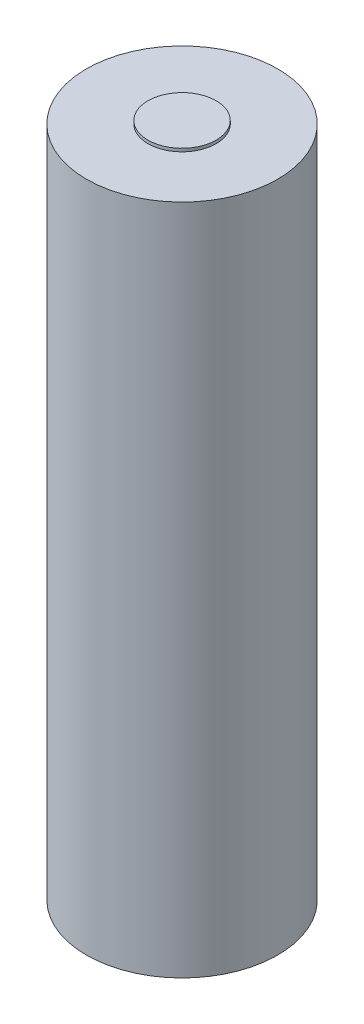
ISO-10303-21;
HEADER;
FILE_DESCRIPTION(('STEP AP214'),'2;1');
FILE_NAME('part.step','',(''),(''),'','','');
FILE_SCHEMA(('AUTOMOTIVE_DESIGN { 1 0 10303 214 1 1 1 1 }'));
ENDSEC;
DATA;
#1=APPLICATION_CONTEXT('core data for automotive mechanical design processes');
#2=APPLICATION_PROTOCOL_DEFINITION('international standard','automotive_design',2000,#1);
#3=PRODUCT_CONTEXT('',#1,'mechanical');
#4=PRODUCT('Part','Part','',(#3));
#5=PRODUCT_RELATED_PRODUCT_CATEGORY('part','',(#4));
#6=PRODUCT_DEFINITION_FORMATION('','',#4);
#7=PRODUCT_DEFINITION_CONTEXT('part definition',#1,'design');
#8=PRODUCT_DEFINITION('design','',#6,#7);
#9=PRODUCT_DEFINITION_SHAPE('','',#8);
#10=(LENGTH_UNIT() NAMED_UNIT(*) SI_UNIT(.MILLI.,.METRE.));
#11=(NAMED_UNIT(*) PLANE_ANGLE_UNIT() SI_UNIT($,.RADIAN.));
#12=(NAMED_UNIT(*) SI_UNIT($,.STERADIAN.) SOLID_ANGLE_UNIT());
#13=UNCERTAINTY_MEASURE_WITH_UNIT(LENGTH_MEASURE(1.E-05),#10,'distance_accuracy_value','');
#14=(GEOMETRIC_REPRESENTATION_CONTEXT(3) GLOBAL_UNCERTAINTY_ASSIGNED_CONTEXT((#13)) GLOBAL_UNIT_ASSIGNED_CONTEXT((#10,
#11,#12)) REPRESENTATION_CONTEXT('',''));
#15=CARTESIAN_POINT('',(0.,0.,0.));
#16=DIRECTION('',(0.,0.,1.));
#17=DIRECTION('',(1.,0.,0.));
#18=AXIS2_PLACEMENT_3D('',#15,#16,#17);
#19=CARTESIAN_POINT('',(0.,65.,0.));
#20=DIRECTION('',(0.,-1.,0.));
#21=DIRECTION('',(0.,0.,-1.));
#22=AXIS2_PLACEMENT_3D('',#19,#20,#21);
#23=CYLINDRICAL_SURFACE('',#22,9.25);
#24=CARTESIAN_POINT('',(0.,65.,0.));
#25=DIRECTION('',(0.,1.,0.));
#26=DIRECTION('',(0.,0.,1.));
#27=AXIS2_PLACEMENT_3D('',#24,#25,#26);
#28=CIRCLE('',#27,9.25);
#29=CARTESIAN_POINT('',(0.,65.,9.25));
#30=VERTEX_POINT('',#29);
#31=EDGE_CURVE('E44',#30,#30,#28,.T.);
#32=ORIENTED_EDGE('',*,*,#31,.F.);
#33=EDGE_LOOP('',(#32));
#34=FACE_BOUND('',#33,.T.);
#35=CARTESIAN_POINT('',(0.,0.,0.));
#36=DIRECTION('',(0.,1.,0.));
#37=DIRECTION('',(0.,0.,1.));
#38=AXIS2_PLACEMENT_3D('',#35,#36,#37);
#39=CIRCLE('',#38,9.25);
#40=CARTESIAN_POINT('',(0.,0.,9.25));
#41=VERTEX_POINT('',#40);
#42=EDGE_CURVE('E40',#41,#41,#39,.T.);
#43=ORIENTED_EDGE('',*,*,#42,.T.);
#44=EDGE_LOOP('',(#43));
#45=FACE_BOUND('',#44,.T.);
#46=ADVANCED_FACE('F37',(#34,#45),#23,.T.);
#47=CARTESIAN_POINT('',(0.,65.,0.));
#48=DIRECTION('',(0.,1.,0.));
#49=DIRECTION('',(0.,0.,1.));
#50=AXIS2_PLACEMENT_3D('',#47,#48,#49);
#51=PLANE('',#50);
#52=CARTESIAN_POINT('',(0.,65.,0.));
#53=DIRECTION('',(0.,1.,0.));
#54=DIRECTION('',(0.,0.,1.));
#55=AXIS2_PLACEMENT_3D('',#52,#53,#54);
#56=CIRCLE('',#55,3.3);
#57=CARTESIAN_POINT('',(0.,65.,3.3));
#58=VERTEX_POINT('',#57);
#59=EDGE_CURVE('E10',#58,#58,#56,.T.);
#60=ORIENTED_EDGE('',*,*,#59,.F.);
#61=EDGE_LOOP('',(#60));
#62=FACE_BOUND('',#61,.T.);
#63=ORIENTED_EDGE('',*,*,#31,.T.);
#64=EDGE_LOOP('',(#63));
#65=FACE_BOUND('',#64,.T.);
#66=ADVANCED_FACE('F61',(#62,#65),#51,.T.);
#67=CARTESIAN_POINT('',(0.,0.,0.));
#68=DIRECTION('',(0.,1.,0.));
#69=DIRECTION('',(0.,0.,1.));
#70=AXIS2_PLACEMENT_3D('',#67,#68,#69);
#71=PLANE('',#70);
#72=ORIENTED_EDGE('',*,*,#42,.F.);
#73=EDGE_LOOP('',(#72));
#74=FACE_BOUND('',#73,.T.);
#75=ADVANCED_FACE('F58',(#74),#71,.F.);
#76=CARTESIAN_POINT('',(0.,65.3,0.));
#77=DIRECTION('',(0.,-1.,0.));
#78=DIRECTION('',(0.,0.,-1.));
#79=AXIS2_PLACEMENT_3D('',#76,#77,#78);
#80=CYLINDRICAL_SURFACE('',#79,3.3);
#81=CARTESIAN_POINT('',(0.,65.3,0.));
#82=DIRECTION('',(0.,1.,0.));
#83=DIRECTION('',(0.,0.,1.));
#84=AXIS2_PLACEMENT_3D('',#81,#82,#83);
#85=CIRCLE('',#84,3.3);
#86=CARTESIAN_POINT('',(0.,65.3,3.3));
#87=VERTEX_POINT('',#86);
#88=EDGE_CURVE('E50',#87,#87,#85,.T.);
#89=ORIENTED_EDGE('',*,*,#88,.F.);
#90=EDGE_LOOP('',(#89));
#91=FACE_BOUND('',#90,.T.);
#92=ORIENTED_EDGE('',*,*,#59,.T.);
#93=EDGE_LOOP('',(#92));
#94=FACE_BOUND('',#93,.T.);
#95=ADVANCED_FACE('F60',(#91,#94),#80,.T.);
#96=CARTESIAN_POINT('',(0.,65.3,0.));
#97=DIRECTION('',(0.,1.,0.));
#98=DIRECTION('',(0.,0.,1.));
#99=AXIS2_PLACEMENT_3D('',#96,#97,#98);
#100=PLANE('',#99);
#101=ORIENTED_EDGE('',*,*,#88,.T.);
#102=EDGE_LOOP('',(#101));
#103=FACE_BOUND('',#102,.T.);
#104=ADVANCED_FACE('F67',(#103),#100,.T.);
#105=CLOSED_SHELL('',(#46,#66,#75,#95,#104));
#106=MANIFOLD_SOLID_BREP('B2',#105);
#107=ADVANCED_BREP_SHAPE_REPRESENTATION('',(#18,#106),#14);
#108=SHAPE_DEFINITION_REPRESENTATION(#9,#107);
ENDSEC;
END-ISO-10303-21;
